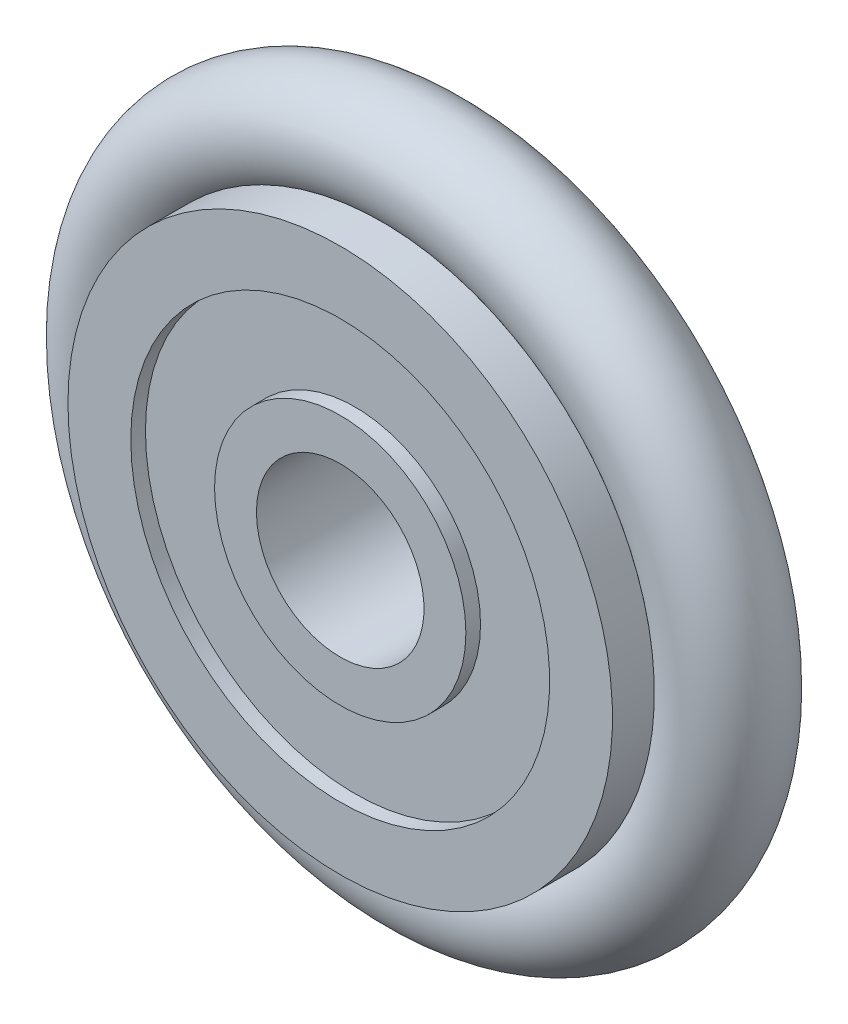
ISO-10303-21;
HEADER;
FILE_DESCRIPTION(('STEP AP214'),'2;1');
FILE_NAME('part.step','',(''),(''),'','','');
FILE_SCHEMA(('AUTOMOTIVE_DESIGN { 1 0 10303 214 1 1 1 1 }'));
ENDSEC;
DATA;
#1=APPLICATION_CONTEXT('core data for automotive mechanical design processes');
#2=APPLICATION_PROTOCOL_DEFINITION('international standard','automotive_design',2000,#1);
#3=PRODUCT_CONTEXT('',#1,'mechanical');
#4=PRODUCT('Part','Part','',(#3));
#5=PRODUCT_RELATED_PRODUCT_CATEGORY('part','',(#4));
#6=PRODUCT_DEFINITION_FORMATION('','',#4);
#7=PRODUCT_DEFINITION_CONTEXT('part definition',#1,'design');
#8=PRODUCT_DEFINITION('design','',#6,#7);
#9=PRODUCT_DEFINITION_SHAPE('','',#8);
#10=(LENGTH_UNIT() NAMED_UNIT(*) SI_UNIT(.MILLI.,.METRE.));
#11=(NAMED_UNIT(*) PLANE_ANGLE_UNIT() SI_UNIT($,.RADIAN.));
#12=(NAMED_UNIT(*) SI_UNIT($,.STERADIAN.) SOLID_ANGLE_UNIT());
#13=UNCERTAINTY_MEASURE_WITH_UNIT(LENGTH_MEASURE(1.E-05),#10,'distance_accuracy_value','');
#14=(GEOMETRIC_REPRESENTATION_CONTEXT(3) GLOBAL_UNCERTAINTY_ASSIGNED_CONTEXT((#13)) GLOBAL_UNIT_ASSIGNED_CONTEXT((#10,
#11,#12)) REPRESENTATION_CONTEXT('',''));
#15=CARTESIAN_POINT('',(0.,0.,0.));
#16=DIRECTION('',(0.,0.,1.));
#17=DIRECTION('',(1.,0.,0.));
#18=AXIS2_PLACEMENT_3D('',#15,#16,#17);
#19=CARTESIAN_POINT('',(0.,0.,0.));
#20=DIRECTION('',(0.,0.,1.));
#21=DIRECTION('',(1.,0.,0.));
#22=AXIS2_PLACEMENT_3D('',#19,#20,#21);
#23=TOROIDAL_SURFACE('',#22,7.25,1.25);
#24=CARTESIAN_POINT('',(8.5,0.,0.));
#25=VERTEX_POINT('',#24);
#26=VERTEX_LOOP('',#25);
#27=FACE_BOUND('',#26,.T.);
#28=ADVANCED_FACE('F49',(#27),#23,.T.);
#29=CLOSED_SHELL('',(#28));
#30=MANIFOLD_SOLID_BREP('B2',#29);
#31=CARTESIAN_POINT('',(2.,0.,-2.));
#32=DIRECTION('',(0.,0.,1.));
#33=DIRECTION('',(1.,0.,0.));
#34=AXIS2_PLACEMENT_3D('',#31,#32,#33);
#35=PLANE('',#34);
#36=CARTESIAN_POINT('',(0.,0.,-2.));
#37=DIRECTION('',(0.,0.,-1.));
#38=DIRECTION('',(-1.,0.,0.));
#39=AXIS2_PLACEMENT_3D('',#36,#37,#38);
#40=CIRCLE('',#39,2.);
#41=CARTESIAN_POINT('',(-2.,0.,-2.));
#42=VERTEX_POINT('',#41);
#43=EDGE_CURVE('E123',#42,#42,#40,.T.);
#44=ORIENTED_EDGE('',*,*,#43,.F.);
#45=EDGE_LOOP('',(#44));
#46=FACE_BOUND('',#45,.T.);
#47=CARTESIAN_POINT('',(0.,0.,-2.));
#48=DIRECTION('',(0.,0.,-1.));
#49=DIRECTION('',(-1.,0.,0.));
#50=AXIS2_PLACEMENT_3D('',#47,#48,#49);
#51=CIRCLE('',#50,3.);
#52=CARTESIAN_POINT('',(-3.,0.,-2.));
#53=VERTEX_POINT('',#52);
#54=EDGE_CURVE('E48',#53,#53,#51,.T.);
#55=ORIENTED_EDGE('',*,*,#54,.T.);
#56=EDGE_LOOP('',(#55));
#57=FACE_BOUND('',#56,.T.);
#58=ADVANCED_FACE('F62',(#46,#57),#35,.F.);
#59=CARTESIAN_POINT('',(0.,0.,-2.));
#60=DIRECTION('',(0.,0.,-1.));
#61=DIRECTION('',(-1.,0.,0.));
#62=AXIS2_PLACEMENT_3D('',#59,#60,#61);
#63=CYLINDRICAL_SURFACE('',#62,3.);
#64=ORIENTED_EDGE('',*,*,#54,.F.);
#65=EDGE_LOOP('',(#64));
#66=FACE_BOUND('',#65,.T.);
#67=CARTESIAN_POINT('',(0.,0.,-1.65000000000001));
#68=DIRECTION('',(0.,0.,-1.));
#69=DIRECTION('',(-1.,0.,0.));
#70=AXIS2_PLACEMENT_3D('',#67,#68,#69);
#71=CIRCLE('',#70,3.);
#72=CARTESIAN_POINT('',(-3.,0.,-1.65000000000001));
#73=VERTEX_POINT('',#72);
#74=EDGE_CURVE('E69',#73,#73,#71,.T.);
#75=ORIENTED_EDGE('',*,*,#74,.T.);
#76=EDGE_LOOP('',(#75));
#77=FACE_BOUND('',#76,.T.);
#78=ADVANCED_FACE('F132',(#66,#77),#63,.T.);
#79=CARTESIAN_POINT('',(3.,0.,-1.65000000000001));
#80=DIRECTION('',(0.,0.,1.));
#81=DIRECTION('',(1.,0.,0.));
#82=AXIS2_PLACEMENT_3D('',#79,#80,#81);
#83=PLANE('',#82);
#84=ORIENTED_EDGE('',*,*,#74,.F.);
#85=EDGE_LOOP('',(#84));
#86=FACE_BOUND('',#85,.T.);
#87=CARTESIAN_POINT('',(0.,0.,-1.65000000000001));
#88=DIRECTION('',(0.,0.,-1.));
#89=DIRECTION('',(-1.,0.,0.));
#90=AXIS2_PLACEMENT_3D('',#87,#88,#89);
#91=CIRCLE('',#90,5.);
#92=CARTESIAN_POINT('',(-5.,0.,-1.65000000000001));
#93=VERTEX_POINT('',#92);
#94=EDGE_CURVE('E75',#93,#93,#91,.T.);
#95=ORIENTED_EDGE('',*,*,#94,.T.);
#96=EDGE_LOOP('',(#95));
#97=FACE_BOUND('',#96,.T.);
#98=ADVANCED_FACE('F136',(#86,#97),#83,.F.);
#99=CARTESIAN_POINT('',(0.,0.,-2.));
#100=DIRECTION('',(0.,0.,-1.));
#101=DIRECTION('',(-1.,0.,0.));
#102=AXIS2_PLACEMENT_3D('',#99,#100,#101);
#103=CYLINDRICAL_SURFACE('',#102,5.);
#104=ORIENTED_EDGE('',*,*,#94,.F.);
#105=EDGE_LOOP('',(#104));
#106=FACE_BOUND('',#105,.T.);
#107=CARTESIAN_POINT('',(0.,0.,-2.));
#108=DIRECTION('',(0.,0.,-1.));
#109=DIRECTION('',(-1.,0.,0.));
#110=AXIS2_PLACEMENT_3D('',#107,#108,#109);
#111=CIRCLE('',#110,5.);
#112=CARTESIAN_POINT('',(-5.,0.,-2.));
#113=VERTEX_POINT('',#112);
#114=EDGE_CURVE('E81',#113,#113,#111,.T.);
#115=ORIENTED_EDGE('',*,*,#114,.T.);
#116=EDGE_LOOP('',(#115));
#117=FACE_BOUND('',#116,.T.);
#118=ADVANCED_FACE('F141',(#106,#117),#103,.F.);
#119=CARTESIAN_POINT('',(5.,0.,-2.));
#120=DIRECTION('',(0.,0.,1.));
#121=DIRECTION('',(1.,0.,0.));
#122=AXIS2_PLACEMENT_3D('',#119,#120,#121);
#123=PLANE('',#122);
#124=ORIENTED_EDGE('',*,*,#114,.F.);
#125=EDGE_LOOP('',(#124));
#126=FACE_BOUND('',#125,.T.);
#127=CARTESIAN_POINT('',(0.,0.,-2.));
#128=DIRECTION('',(0.,0.,-1.));
#129=DIRECTION('',(-1.,0.,0.));
#130=AXIS2_PLACEMENT_3D('',#127,#128,#129);
#131=CIRCLE('',#130,6.5);
#132=CARTESIAN_POINT('',(-6.5,0.,-2.));
#133=VERTEX_POINT('',#132);
#134=EDGE_CURVE('E87',#133,#133,#131,.T.);
#135=ORIENTED_EDGE('',*,*,#134,.T.);
#136=EDGE_LOOP('',(#135));
#137=FACE_BOUND('',#136,.T.);
#138=ADVANCED_FACE('F147',(#126,#137),#123,.F.);
#139=CARTESIAN_POINT('',(0.,0.,-2.));
#140=DIRECTION('',(0.,0.,-1.));
#141=DIRECTION('',(-1.,0.,0.));
#142=AXIS2_PLACEMENT_3D('',#139,#140,#141);
#143=CYLINDRICAL_SURFACE('',#142,6.5);
#144=ORIENTED_EDGE('',*,*,#134,.F.);
#145=EDGE_LOOP('',(#144));
#146=FACE_BOUND('',#145,.T.);
#147=CARTESIAN_POINT('',(0.,0.,-1.));
#148=DIRECTION('',(0.,0.,-1.));
#149=DIRECTION('',(-1.,0.,0.));
#150=AXIS2_PLACEMENT_3D('',#147,#148,#149);
#151=CIRCLE('',#150,6.5);
#152=CARTESIAN_POINT('',(-6.5,0.,-1.));
#153=VERTEX_POINT('',#152);
#154=EDGE_CURVE('E91',#153,#153,#151,.T.);
#155=ORIENTED_EDGE('',*,*,#154,.T.);
#156=EDGE_LOOP('',(#155));
#157=FACE_BOUND('',#156,.T.);
#158=ADVANCED_FACE('F151',(#146,#157),#143,.T.);
#159=CARTESIAN_POINT('',(0.,0.,0.));
#160=DIRECTION('',(0.,0.,-1.));
#161=DIRECTION('',(-1.,0.,0.));
#162=AXIS2_PLACEMENT_3D('',#159,#160,#161);
#163=TOROIDAL_SURFACE('',#162,7.25,1.25);
#164=ORIENTED_EDGE('',*,*,#154,.F.);
#165=EDGE_LOOP('',(#164));
#166=FACE_BOUND('',#165,.T.);
#167=CARTESIAN_POINT('',(0.,0.,1.));
#168=DIRECTION('',(0.,0.,-1.));
#169=DIRECTION('',(-1.,0.,0.));
#170=AXIS2_PLACEMENT_3D('',#167,#168,#169);
#171=CIRCLE('',#170,6.5);
#172=CARTESIAN_POINT('',(-6.5,0.,1.));
#173=VERTEX_POINT('',#172);
#174=EDGE_CURVE('E95',#173,#173,#171,.T.);
#175=ORIENTED_EDGE('',*,*,#174,.T.);
#176=EDGE_LOOP('',(#175));
#177=FACE_BOUND('',#176,.T.);
#178=ADVANCED_FACE('F155',(#166,#177),#163,.F.);
#179=CARTESIAN_POINT('',(0.,0.,-2.));
#180=DIRECTION('',(0.,0.,-1.));
#181=DIRECTION('',(-1.,0.,0.));
#182=AXIS2_PLACEMENT_3D('',#179,#180,#181);
#183=CYLINDRICAL_SURFACE('',#182,6.5);
#184=ORIENTED_EDGE('',*,*,#174,.F.);
#185=EDGE_LOOP('',(#184));
#186=FACE_BOUND('',#185,.T.);
#187=CARTESIAN_POINT('',(0.,0.,2.));
#188=DIRECTION('',(0.,0.,-1.));
#189=DIRECTION('',(-1.,0.,0.));
#190=AXIS2_PLACEMENT_3D('',#187,#188,#189);
#191=CIRCLE('',#190,6.5);
#192=CARTESIAN_POINT('',(-6.5,0.,2.));
#193=VERTEX_POINT('',#192);
#194=EDGE_CURVE('E99',#193,#193,#191,.T.);
#195=ORIENTED_EDGE('',*,*,#194,.T.);
#196=EDGE_LOOP('',(#195));
#197=FACE_BOUND('',#196,.T.);
#198=ADVANCED_FACE('F159',(#186,#197),#183,.T.);
#199=CARTESIAN_POINT('',(5.,0.,2.));
#200=DIRECTION('',(0.,0.,-1.));
#201=DIRECTION('',(-1.,0.,0.));
#202=AXIS2_PLACEMENT_3D('',#199,#200,#201);
#203=PLANE('',#202);
#204=ORIENTED_EDGE('',*,*,#194,.F.);
#205=EDGE_LOOP('',(#204));
#206=FACE_BOUND('',#205,.T.);
#207=CARTESIAN_POINT('',(0.,0.,2.));
#208=DIRECTION('',(0.,0.,-1.));
#209=DIRECTION('',(-1.,0.,0.));
#210=AXIS2_PLACEMENT_3D('',#207,#208,#209);
#211=CIRCLE('',#210,5.);
#212=CARTESIAN_POINT('',(-5.,0.,2.));
#213=VERTEX_POINT('',#212);
#214=EDGE_CURVE('E103',#213,#213,#211,.T.);
#215=ORIENTED_EDGE('',*,*,#214,.T.);
#216=EDGE_LOOP('',(#215));
#217=FACE_BOUND('',#216,.T.);
#218=ADVANCED_FACE('F163',(#206,#217),#203,.F.);
#219=CARTESIAN_POINT('',(0.,0.,-2.));
#220=DIRECTION('',(0.,0.,-1.));
#221=DIRECTION('',(-1.,0.,0.));
#222=AXIS2_PLACEMENT_3D('',#219,#220,#221);
#223=CYLINDRICAL_SURFACE('',#222,5.);
#224=ORIENTED_EDGE('',*,*,#214,.F.);
#225=EDGE_LOOP('',(#224));
#226=FACE_BOUND('',#225,.T.);
#227=CARTESIAN_POINT('',(0.,0.,1.65000000000001));
#228=DIRECTION('',(0.,0.,-1.));
#229=DIRECTION('',(-1.,0.,0.));
#230=AXIS2_PLACEMENT_3D('',#227,#228,#229);
#231=CIRCLE('',#230,5.);
#232=CARTESIAN_POINT('',(-5.,0.,1.65000000000001));
#233=VERTEX_POINT('',#232);
#234=EDGE_CURVE('E107',#233,#233,#231,.T.);
#235=ORIENTED_EDGE('',*,*,#234,.T.);
#236=EDGE_LOOP('',(#235));
#237=FACE_BOUND('',#236,.T.);
#238=ADVANCED_FACE('F167',(#226,#237),#223,.F.);
#239=CARTESIAN_POINT('',(3.,0.,1.65000000000001));
#240=DIRECTION('',(0.,0.,-1.));
#241=DIRECTION('',(-1.,0.,0.));
#242=AXIS2_PLACEMENT_3D('',#239,#240,#241);
#243=PLANE('',#242);
#244=ORIENTED_EDGE('',*,*,#234,.F.);
#245=EDGE_LOOP('',(#244));
#246=FACE_BOUND('',#245,.T.);
#247=CARTESIAN_POINT('',(0.,0.,1.65000000000001));
#248=DIRECTION('',(0.,0.,-1.));
#249=DIRECTION('',(-1.,0.,0.));
#250=AXIS2_PLACEMENT_3D('',#247,#248,#249);
#251=CIRCLE('',#250,3.);
#252=CARTESIAN_POINT('',(-3.,0.,1.65000000000001));
#253=VERTEX_POINT('',#252);
#254=EDGE_CURVE('E111',#253,#253,#251,.T.);
#255=ORIENTED_EDGE('',*,*,#254,.T.);
#256=EDGE_LOOP('',(#255));
#257=FACE_BOUND('',#256,.T.);
#258=ADVANCED_FACE('F171',(#246,#257),#243,.F.);
#259=CARTESIAN_POINT('',(0.,0.,-2.));
#260=DIRECTION('',(0.,0.,-1.));
#261=DIRECTION('',(-1.,0.,0.));
#262=AXIS2_PLACEMENT_3D('',#259,#260,#261);
#263=CYLINDRICAL_SURFACE('',#262,3.);
#264=ORIENTED_EDGE('',*,*,#254,.F.);
#265=EDGE_LOOP('',(#264));
#266=FACE_BOUND('',#265,.T.);
#267=CARTESIAN_POINT('',(0.,0.,2.));
#268=DIRECTION('',(0.,0.,-1.));
#269=DIRECTION('',(-1.,0.,0.));
#270=AXIS2_PLACEMENT_3D('',#267,#268,#269);
#271=CIRCLE('',#270,3.);
#272=CARTESIAN_POINT('',(-3.,0.,2.));
#273=VERTEX_POINT('',#272);
#274=EDGE_CURVE('E115',#273,#273,#271,.T.);
#275=ORIENTED_EDGE('',*,*,#274,.T.);
#276=EDGE_LOOP('',(#275));
#277=FACE_BOUND('',#276,.T.);
#278=ADVANCED_FACE('F175',(#266,#277),#263,.T.);
#279=CARTESIAN_POINT('',(2.,0.,2.));
#280=DIRECTION('',(0.,0.,-1.));
#281=DIRECTION('',(-1.,0.,0.));
#282=AXIS2_PLACEMENT_3D('',#279,#280,#281);
#283=PLANE('',#282);
#284=ORIENTED_EDGE('',*,*,#274,.F.);
#285=EDGE_LOOP('',(#284));
#286=FACE_BOUND('',#285,.T.);
#287=CARTESIAN_POINT('',(0.,0.,2.));
#288=DIRECTION('',(0.,0.,-1.));
#289=DIRECTION('',(-1.,0.,0.));
#290=AXIS2_PLACEMENT_3D('',#287,#288,#289);
#291=CIRCLE('',#290,2.);
#292=CARTESIAN_POINT('',(-2.,0.,2.));
#293=VERTEX_POINT('',#292);
#294=EDGE_CURVE('E119',#293,#293,#291,.T.);
#295=ORIENTED_EDGE('',*,*,#294,.T.);
#296=EDGE_LOOP('',(#295));
#297=FACE_BOUND('',#296,.T.);
#298=ADVANCED_FACE('F179',(#286,#297),#283,.F.);
#299=CARTESIAN_POINT('',(0.,0.,-2.));
#300=DIRECTION('',(0.,0.,-1.));
#301=DIRECTION('',(-1.,0.,0.));
#302=AXIS2_PLACEMENT_3D('',#299,#300,#301);
#303=CYLINDRICAL_SURFACE('',#302,2.);
#304=ORIENTED_EDGE('',*,*,#294,.F.);
#305=EDGE_LOOP('',(#304));
#306=FACE_BOUND('',#305,.T.);
#307=ORIENTED_EDGE('',*,*,#43,.T.);
#308=EDGE_LOOP('',(#307));
#309=FACE_BOUND('',#308,.T.);
#310=ADVANCED_FACE('F129',(#306,#309),#303,.F.);
#311=CLOSED_SHELL('',(#58,#78,#98,#118,#138,#158,#178,#198,#218,#238,#258,#278,#298,#310));
#312=MANIFOLD_SOLID_BREP('B6',#311);
#313=ADVANCED_BREP_SHAPE_REPRESENTATION('',(#18,#30,#312),#14);
#314=SHAPE_DEFINITION_REPRESENTATION(#9,#313);
ENDSEC;
END-ISO-10303-21;
